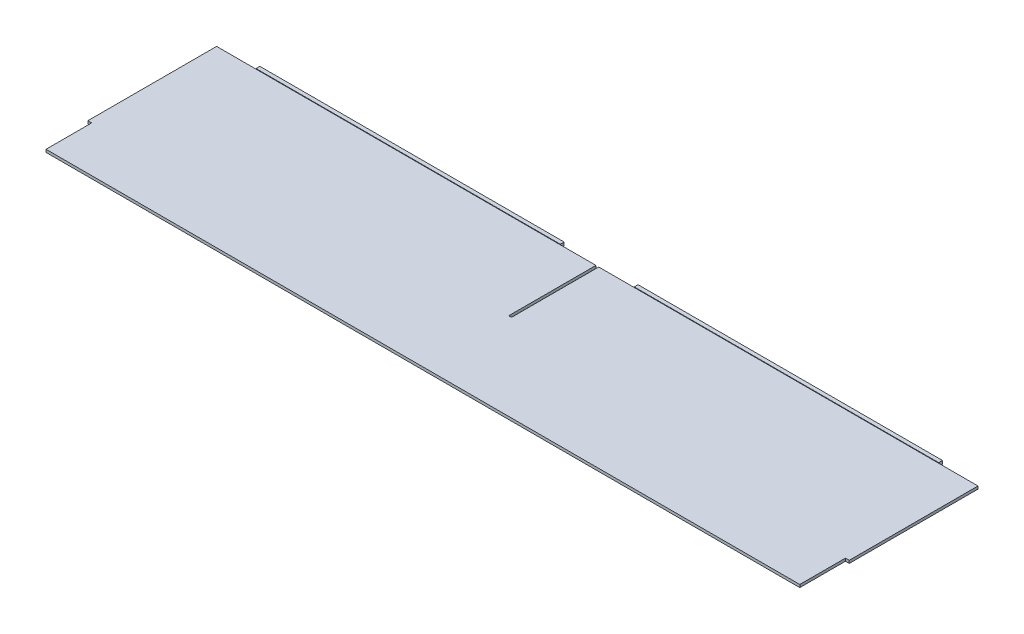
ISO-10303-21;
HEADER;
FILE_DESCRIPTION(('STEP AP214'),'2;1');
FILE_NAME('part.step','',(''),(''),'','','');
FILE_SCHEMA(('AUTOMOTIVE_DESIGN { 1 0 10303 214 1 1 1 1 }'));
ENDSEC;
DATA;
#1=APPLICATION_CONTEXT('core data for automotive mechanical design processes');
#2=APPLICATION_PROTOCOL_DEFINITION('international standard','automotive_design',2000,#1);
#3=PRODUCT_CONTEXT('',#1,'mechanical');
#4=PRODUCT('Part','Part','',(#3));
#5=PRODUCT_RELATED_PRODUCT_CATEGORY('part','',(#4));
#6=PRODUCT_DEFINITION_FORMATION('','',#4);
#7=PRODUCT_DEFINITION_CONTEXT('part definition',#1,'design');
#8=PRODUCT_DEFINITION('design','',#6,#7);
#9=PRODUCT_DEFINITION_SHAPE('','',#8);
#10=(LENGTH_UNIT() NAMED_UNIT(*) SI_UNIT(.MILLI.,.METRE.));
#11=(NAMED_UNIT(*) PLANE_ANGLE_UNIT() SI_UNIT($,.RADIAN.));
#12=(NAMED_UNIT(*) SI_UNIT($,.STERADIAN.) SOLID_ANGLE_UNIT());
#13=UNCERTAINTY_MEASURE_WITH_UNIT(LENGTH_MEASURE(1.E-05),#10,'distance_accuracy_value','');
#14=(GEOMETRIC_REPRESENTATION_CONTEXT(3) GLOBAL_UNCERTAINTY_ASSIGNED_CONTEXT((#13)) GLOBAL_UNIT_ASSIGNED_CONTEXT((#10,
#11,#12)) REPRESENTATION_CONTEXT('',''));
#15=CARTESIAN_POINT('',(0.,0.,0.));
#16=DIRECTION('',(0.,0.,1.));
#17=DIRECTION('',(1.,0.,0.));
#18=AXIS2_PLACEMENT_3D('',#15,#16,#17);
#19=CARTESIAN_POINT('',(-317.6778,1.143,-72.771));
#20=DIRECTION('',(0.,0.,1.));
#21=DIRECTION('',(1.,0.,0.));
#22=AXIS2_PLACEMENT_3D('',#19,#20,#21);
#23=PLANE('',#22);
#24=DIRECTION('',(-1.,0.,0.));
#25=VECTOR('',#24,1.);
#26=CARTESIAN_POINT('',(-317.6778,1.143,-72.771));
#27=LINE('',#26,#25);
#28=CARTESIAN_POINT('',(-1.14299999999913,1.143,-72.771));
#29=VERTEX_POINT('',#28);
#30=CARTESIAN_POINT('',(-30.8229000000015,1.143,-72.771));
#31=VERTEX_POINT('',#30);
#32=EDGE_CURVE('E199',#29,#31,#27,.T.);
#33=ORIENTED_EDGE('',*,*,#32,.F.);
#34=DIRECTION('',(0.,-1.,0.));
#35=VECTOR('',#34,1.);
#36=CARTESIAN_POINT('',(-1.14299999999912,1.143,-72.771));
#37=LINE('',#36,#35);
#38=CARTESIAN_POINT('',(-1.14299999999913,-1.143,-72.771));
#39=VERTEX_POINT('',#38);
#40=EDGE_CURVE('E11',#29,#39,#37,.T.);
#41=ORIENTED_EDGE('',*,*,#40,.T.);
#42=DIRECTION('',(-1.,0.,0.));
#43=VECTOR('',#42,1.);
#44=CARTESIAN_POINT('',(-317.6778,-1.143,-72.771));
#45=LINE('',#44,#43);
#46=CARTESIAN_POINT('',(-30.8229000000015,-1.143,-72.771));
#47=VERTEX_POINT('',#46);
#48=EDGE_CURVE('E197',#39,#47,#45,.T.);
#49=ORIENTED_EDGE('',*,*,#48,.T.);
#50=DIRECTION('',(0.,-1.,0.));
#51=VECTOR('',#50,1.);
#52=CARTESIAN_POINT('',(-30.8229000000015,-1.143,-72.771));
#53=LINE('',#52,#51);
#54=EDGE_CURVE('E231',#31,#47,#53,.T.);
#55=ORIENTED_EDGE('',*,*,#54,.F.);
#56=EDGE_LOOP('',(#33,#41,#49,#55));
#57=FACE_BOUND('',#56,.T.);
#58=ADVANCED_FACE('F33',(#57),#23,.F.);
#59=CARTESIAN_POINT('',(317.6778,1.143,-72.771));
#60=DIRECTION('',(-1.,0.,0.));
#61=DIRECTION('',(0.,0.,1.));
#62=AXIS2_PLACEMENT_3D('',#59,#60,#61);
#63=PLANE('',#62);
#64=DIRECTION('',(0.,-1.,0.));
#65=VECTOR('',#64,1.);
#66=CARTESIAN_POINT('',(317.6778,1.58749999999994,34.671));
#67=LINE('',#66,#65);
#68=CARTESIAN_POINT('',(317.6778,1.143,34.671));
#69=VERTEX_POINT('',#68);
#70=CARTESIAN_POINT('',(317.6778,-1.143,34.671));
#71=VERTEX_POINT('',#70);
#72=EDGE_CURVE('E297',#69,#71,#67,.T.);
#73=ORIENTED_EDGE('',*,*,#72,.T.);
#74=DIRECTION('',(0.,0.,-1.));
#75=VECTOR('',#74,1.);
#76=CARTESIAN_POINT('',(317.6778,-1.143,-72.771));
#77=LINE('',#76,#75);
#78=CARTESIAN_POINT('',(317.6778,-1.143,-72.771));
#79=VERTEX_POINT('',#78);
#80=EDGE_CURVE('E209',#71,#79,#77,.T.);
#81=ORIENTED_EDGE('',*,*,#80,.T.);
#82=DIRECTION('',(0.,-1.,0.));
#83=VECTOR('',#82,1.);
#84=CARTESIAN_POINT('',(317.6778,1.143,-72.771));
#85=LINE('',#84,#83);
#86=CARTESIAN_POINT('',(317.6778,1.143,-72.771));
#87=VERTEX_POINT('',#86);
#88=EDGE_CURVE('E229',#87,#79,#85,.T.);
#89=ORIENTED_EDGE('',*,*,#88,.F.);
#90=DIRECTION('',(0.,0.,-1.));
#91=VECTOR('',#90,1.);
#92=CARTESIAN_POINT('',(317.6778,1.143,-72.771));
#93=LINE('',#92,#91);
#94=EDGE_CURVE('E224',#69,#87,#93,.T.);
#95=ORIENTED_EDGE('',*,*,#94,.F.);
#96=EDGE_LOOP('',(#73,#81,#89,#95));
#97=FACE_BOUND('',#96,.T.);
#98=ADVANCED_FACE('F35',(#97),#63,.F.);
#99=CARTESIAN_POINT('',(-317.6778,1.143,72.771));
#100=DIRECTION('',(0.,0.,-1.));
#101=DIRECTION('',(-1.,0.,0.));
#102=AXIS2_PLACEMENT_3D('',#99,#100,#101);
#103=PLANE('',#102);
#104=DIRECTION('',(0.,-1.,0.));
#105=VECTOR('',#104,1.);
#106=CARTESIAN_POINT('',(314.5028,1.58749999999994,72.771));
#107=LINE('',#106,#105);
#108=CARTESIAN_POINT('',(314.5028,1.143,72.771));
#109=VERTEX_POINT('',#108);
#110=CARTESIAN_POINT('',(314.5028,-1.143,72.771));
#111=VERTEX_POINT('',#110);
#112=EDGE_CURVE('E56',#109,#111,#107,.T.);
#113=ORIENTED_EDGE('',*,*,#112,.F.);
#114=DIRECTION('',(1.,0.,0.));
#115=VECTOR('',#114,1.);
#116=CARTESIAN_POINT('',(-317.6778,1.143,72.771));
#117=LINE('',#116,#115);
#118=CARTESIAN_POINT('',(-314.5028,1.143,72.771));
#119=VERTEX_POINT('',#118);
#120=EDGE_CURVE('E230',#119,#109,#117,.T.);
#121=ORIENTED_EDGE('',*,*,#120,.F.);
#122=DIRECTION('',(0.,-1.,0.));
#123=VECTOR('',#122,1.);
#124=CARTESIAN_POINT('',(-314.5028,1.58749999999994,72.771));
#125=LINE('',#124,#123);
#126=CARTESIAN_POINT('',(-314.5028,-1.143,72.771));
#127=VERTEX_POINT('',#126);
#128=EDGE_CURVE('E321',#119,#127,#125,.T.);
#129=ORIENTED_EDGE('',*,*,#128,.T.);
#130=DIRECTION('',(1.,0.,0.));
#131=VECTOR('',#130,1.);
#132=CARTESIAN_POINT('',(-317.6778,-1.143,72.771));
#133=LINE('',#132,#131);
#134=EDGE_CURVE('E218',#127,#111,#133,.T.);
#135=ORIENTED_EDGE('',*,*,#134,.T.);
#136=EDGE_LOOP('',(#113,#121,#129,#135));
#137=FACE_BOUND('',#136,.T.);
#138=ADVANCED_FACE('F396',(#137),#103,.F.);
#139=CARTESIAN_POINT('',(0.,1.143,0.));
#140=DIRECTION('',(0.,1.,0.));
#141=DIRECTION('',(0.,0.,1.));
#142=AXIS2_PLACEMENT_3D('',#139,#140,#141);
#143=PLANE('',#142);
#144=DIRECTION('',(0.,0.,1.));
#145=VECTOR('',#144,1.);
#146=CARTESIAN_POINT('',(-1.14299999999912,1.143,0.));
#147=LINE('',#146,#145);
#148=CARTESIAN_POINT('',(-1.14299999999912,1.143,0.));
#149=VERTEX_POINT('',#148);
#150=EDGE_CURVE('E402',#29,#149,#147,.T.);
#151=ORIENTED_EDGE('',*,*,#150,.F.);
#152=ORIENTED_EDGE('',*,*,#32,.T.);
#153=CARTESIAN_POINT('',(-284.822900000001,1.143,-72.771));
#154=VERTEX_POINT('',#153);
#155=EDGE_CURVE('E288',#31,#154,#27,.T.);
#156=ORIENTED_EDGE('',*,*,#155,.T.);
#157=CARTESIAN_POINT('',(-317.6778,1.143,-72.771));
#158=VERTEX_POINT('',#157);
#159=EDGE_CURVE('E282',#154,#158,#27,.T.);
#160=ORIENTED_EDGE('',*,*,#159,.T.);
#161=DIRECTION('',(0.,0.,1.));
#162=VECTOR('',#161,1.);
#163=CARTESIAN_POINT('',(-317.6778,1.143,-72.771));
#164=LINE('',#163,#162);
#165=CARTESIAN_POINT('',(-317.6778,1.143,34.671));
#166=VERTEX_POINT('',#165);
#167=EDGE_CURVE('E286',#158,#166,#164,.T.);
#168=ORIENTED_EDGE('',*,*,#167,.T.);
#169=DIRECTION('',(-1.,0.,0.));
#170=VECTOR('',#169,1.);
#171=CARTESIAN_POINT('',(0.,1.143,34.671));
#172=LINE('',#171,#170);
#173=CARTESIAN_POINT('',(-314.5028,1.143,34.671));
#174=VERTEX_POINT('',#173);
#175=EDGE_CURVE('E324',#174,#166,#172,.T.);
#176=ORIENTED_EDGE('',*,*,#175,.F.);
#177=DIRECTION('',(0.,0.,-1.));
#178=VECTOR('',#177,1.);
#179=CARTESIAN_POINT('',(-314.5028,1.143,0.));
#180=LINE('',#179,#178);
#181=EDGE_CURVE('E329',#119,#174,#180,.T.);
#182=ORIENTED_EDGE('',*,*,#181,.F.);
#183=ORIENTED_EDGE('',*,*,#120,.T.);
#184=DIRECTION('',(0.,0.,-1.));
#185=VECTOR('',#184,1.);
#186=CARTESIAN_POINT('',(314.5028,1.143,0.));
#187=LINE('',#186,#185);
#188=CARTESIAN_POINT('',(314.5028,1.143,34.671));
#189=VERTEX_POINT('',#188);
#190=EDGE_CURVE('E308',#109,#189,#187,.T.);
#191=ORIENTED_EDGE('',*,*,#190,.T.);
#192=DIRECTION('',(1.,0.,0.));
#193=VECTOR('',#192,1.);
#194=CARTESIAN_POINT('',(0.,1.143,34.671));
#195=LINE('',#194,#193);
#196=EDGE_CURVE('E307',#189,#69,#195,.T.);
#197=ORIENTED_EDGE('',*,*,#196,.T.);
#198=ORIENTED_EDGE('',*,*,#94,.T.);
#199=CARTESIAN_POINT('',(284.822900000001,1.143,-72.771));
#200=VERTEX_POINT('',#199);
#201=EDGE_CURVE('E283',#87,#200,#27,.T.);
#202=ORIENTED_EDGE('',*,*,#201,.T.);
#203=DIRECTION('',(1.,0.,0.));
#204=VECTOR('',#203,1.);
#205=CARTESIAN_POINT('',(0.,1.143,-72.771));
#206=LINE('',#205,#204);
#207=CARTESIAN_POINT('',(30.8229000000014,1.143,-72.771));
#208=VERTEX_POINT('',#207);
#209=EDGE_CURVE('E241',#208,#200,#206,.T.);
#210=ORIENTED_EDGE('',*,*,#209,.F.);
#211=CARTESIAN_POINT('',(1.19380000000086,1.143,-72.771));
#212=VERTEX_POINT('',#211);
#213=EDGE_CURVE('E287',#208,#212,#27,.T.);
#214=ORIENTED_EDGE('',*,*,#213,.T.);
#215=DIRECTION('',(0.,0.,-1.));
#216=VECTOR('',#215,1.);
#217=CARTESIAN_POINT('',(1.19380000000088,1.143,0.));
#218=LINE('',#217,#216);
#219=CARTESIAN_POINT('',(1.19380000000088,1.143,0.));
#220=VERTEX_POINT('',#219);
#221=EDGE_CURVE('E48',#220,#212,#218,.T.);
#222=ORIENTED_EDGE('',*,*,#221,.F.);
#223=DIRECTION('',(1.,0.,0.));
#224=VECTOR('',#223,1.);
#225=CARTESIAN_POINT('',(0.,1.143,0.));
#226=LINE('',#225,#224);
#227=EDGE_CURVE('E399',#149,#220,#226,.T.);
#228=ORIENTED_EDGE('',*,*,#227,.F.);
#229=EDGE_LOOP('',(#151,#152,#156,#160,#168,#176,#182,#183,#191,#197,#198,#202,#210,#214,#222,#228));
#230=FACE_BOUND('',#229,.T.);
#231=ADVANCED_FACE('F304',(#230),#143,.T.);
#232=CARTESIAN_POINT('',(0.,-1.143,0.));
#233=DIRECTION('',(0.,1.,0.));
#234=DIRECTION('',(0.,0.,1.));
#235=AXIS2_PLACEMENT_3D('',#232,#233,#234);
#236=PLANE('',#235);
#237=ORIENTED_EDGE('',*,*,#48,.F.);
#238=DIRECTION('',(0.,0.,-1.));
#239=VECTOR('',#238,1.);
#240=CARTESIAN_POINT('',(-1.14299999999913,-1.143,-72.771));
#241=LINE('',#240,#239);
#242=CARTESIAN_POINT('',(-1.14299999999912,-1.143,0.));
#243=VERTEX_POINT('',#242);
#244=EDGE_CURVE('E183',#243,#39,#241,.T.);
#245=ORIENTED_EDGE('',*,*,#244,.F.);
#246=DIRECTION('',(-1.,0.,0.));
#247=VECTOR('',#246,1.);
#248=CARTESIAN_POINT('',(-1.14299999999912,-1.143,0.));
#249=LINE('',#248,#247);
#250=CARTESIAN_POINT('',(1.19380000000088,-1.143,0.));
#251=VERTEX_POINT('',#250);
#252=EDGE_CURVE('E526',#251,#243,#249,.T.);
#253=ORIENTED_EDGE('',*,*,#252,.F.);
#254=DIRECTION('',(0.,0.,1.));
#255=VECTOR('',#254,1.);
#256=CARTESIAN_POINT('',(1.19380000000087,-1.143,-72.771));
#257=LINE('',#256,#255);
#258=CARTESIAN_POINT('',(1.19380000000087,-1.143,-72.771));
#259=VERTEX_POINT('',#258);
#260=EDGE_CURVE('E192',#259,#251,#257,.T.);
#261=ORIENTED_EDGE('',*,*,#260,.F.);
#262=CARTESIAN_POINT('',(30.8229000000015,-1.143,-72.771));
#263=VERTEX_POINT('',#262);
#264=EDGE_CURVE('E204',#263,#259,#45,.T.);
#265=ORIENTED_EDGE('',*,*,#264,.F.);
#266=DIRECTION('',(0.,0.,1.));
#267=VECTOR('',#266,1.);
#268=CARTESIAN_POINT('',(30.8229000000015,-1.143,-75.946));
#269=LINE('',#268,#267);
#270=CARTESIAN_POINT('',(30.8229000000015,-1.143,-75.946));
#271=VERTEX_POINT('',#270);
#272=EDGE_CURVE('E254',#271,#263,#269,.T.);
#273=ORIENTED_EDGE('',*,*,#272,.F.);
#274=DIRECTION('',(-1.,0.,0.));
#275=VECTOR('',#274,1.);
#276=CARTESIAN_POINT('',(284.822900000001,-1.143,-75.946));
#277=LINE('',#276,#275);
#278=CARTESIAN_POINT('',(284.822900000001,-1.143,-75.946));
#279=VERTEX_POINT('',#278);
#280=EDGE_CURVE('E334',#279,#271,#277,.T.);
#281=ORIENTED_EDGE('',*,*,#280,.F.);
#282=DIRECTION('',(0.,0.,1.));
#283=VECTOR('',#282,1.);
#284=CARTESIAN_POINT('',(284.822900000001,-1.143,-75.946));
#285=LINE('',#284,#283);
#286=CARTESIAN_POINT('',(284.822900000001,-1.143,-72.771));
#287=VERTEX_POINT('',#286);
#288=EDGE_CURVE('E246',#279,#287,#285,.T.);
#289=ORIENTED_EDGE('',*,*,#288,.T.);
#290=EDGE_CURVE('E207',#79,#287,#45,.T.);
#291=ORIENTED_EDGE('',*,*,#290,.F.);
#292=ORIENTED_EDGE('',*,*,#80,.F.);
#293=DIRECTION('',(-1.,0.,0.));
#294=VECTOR('',#293,1.);
#295=CARTESIAN_POINT('',(317.6778,-1.143,34.671));
#296=LINE('',#295,#294);
#297=CARTESIAN_POINT('',(314.5028,-1.143,34.671));
#298=VERTEX_POINT('',#297);
#299=EDGE_CURVE('E398',#71,#298,#296,.T.);
#300=ORIENTED_EDGE('',*,*,#299,.T.);
#301=DIRECTION('',(0.,0.,1.));
#302=VECTOR('',#301,1.);
#303=CARTESIAN_POINT('',(314.5028,-1.143,72.771));
#304=LINE('',#303,#302);
#305=EDGE_CURVE('E397',#298,#111,#304,.T.);
#306=ORIENTED_EDGE('',*,*,#305,.T.);
#307=ORIENTED_EDGE('',*,*,#134,.F.);
#308=DIRECTION('',(0.,0.,1.));
#309=VECTOR('',#308,1.);
#310=CARTESIAN_POINT('',(-314.5028,-1.143,72.771));
#311=LINE('',#310,#309);
#312=CARTESIAN_POINT('',(-314.5028,-1.143,34.671));
#313=VERTEX_POINT('',#312);
#314=EDGE_CURVE('E314',#313,#127,#311,.T.);
#315=ORIENTED_EDGE('',*,*,#314,.F.);
#316=DIRECTION('',(1.,0.,0.));
#317=VECTOR('',#316,1.);
#318=CARTESIAN_POINT('',(-317.6778,-1.143,34.671));
#319=LINE('',#318,#317);
#320=CARTESIAN_POINT('',(-317.6778,-1.143,34.671));
#321=VERTEX_POINT('',#320);
#322=EDGE_CURVE('E311',#321,#313,#319,.T.);
#323=ORIENTED_EDGE('',*,*,#322,.F.);
#324=DIRECTION('',(0.,0.,1.));
#325=VECTOR('',#324,1.);
#326=CARTESIAN_POINT('',(-317.6778,-1.143,-72.771));
#327=LINE('',#326,#325);
#328=CARTESIAN_POINT('',(-317.6778,-1.143,-72.771));
#329=VERTEX_POINT('',#328);
#330=EDGE_CURVE('E212',#329,#321,#327,.T.);
#331=ORIENTED_EDGE('',*,*,#330,.F.);
#332=CARTESIAN_POINT('',(-284.822900000001,-1.143,-72.771));
#333=VERTEX_POINT('',#332);
#334=EDGE_CURVE('E205',#333,#329,#45,.T.);
#335=ORIENTED_EDGE('',*,*,#334,.F.);
#336=DIRECTION('',(0.,0.,1.));
#337=VECTOR('',#336,1.);
#338=CARTESIAN_POINT('',(-284.822900000001,-1.143,-75.946));
#339=LINE('',#338,#337);
#340=CARTESIAN_POINT('',(-284.822900000001,-1.143,-75.946));
#341=VERTEX_POINT('',#340);
#342=EDGE_CURVE('E274',#341,#333,#339,.T.);
#343=ORIENTED_EDGE('',*,*,#342,.F.);
#344=DIRECTION('',(-1.,0.,0.));
#345=VECTOR('',#344,1.);
#346=CARTESIAN_POINT('',(-30.8229000000015,-1.143,-75.946));
#347=LINE('',#346,#345);
#348=CARTESIAN_POINT('',(-30.8229000000015,-1.143,-75.946));
#349=VERTEX_POINT('',#348);
#350=EDGE_CURVE('E261',#349,#341,#347,.T.);
#351=ORIENTED_EDGE('',*,*,#350,.F.);
#352=DIRECTION('',(0.,0.,1.));
#353=VECTOR('',#352,1.);
#354=CARTESIAN_POINT('',(-30.8229000000015,-1.143,-75.946));
#355=LINE('',#354,#353);
#356=EDGE_CURVE('E203',#349,#47,#355,.T.);
#357=ORIENTED_EDGE('',*,*,#356,.T.);
#358=EDGE_LOOP('',(#237,#245,#253,#261,#265,#273,#281,#289,#291,#292,#300,#306,#307,#315,#323,
#331,#335,#343,#351,#357));
#359=FACE_BOUND('',#358,.T.);
#360=ADVANCED_FACE('F201',(#359),#236,.F.);
#361=DIRECTION('',(0.,-1.,0.));
#362=VECTOR('',#361,1.);
#363=CARTESIAN_POINT('',(284.822900000001,-1.143,-72.771));
#364=LINE('',#363,#362);
#365=EDGE_CURVE('E302',#200,#287,#364,.T.);
#366=ORIENTED_EDGE('',*,*,#365,.F.);
#367=ORIENTED_EDGE('',*,*,#201,.F.);
#368=ORIENTED_EDGE('',*,*,#88,.T.);
#369=ORIENTED_EDGE('',*,*,#290,.T.);
#370=EDGE_LOOP('',(#366,#367,#368,#369));
#371=FACE_BOUND('',#370,.T.);
#372=ADVANCED_FACE('F301',(#371),#23,.F.);
#373=ORIENTED_EDGE('',*,*,#264,.T.);
#374=DIRECTION('',(0.,1.,0.));
#375=VECTOR('',#374,1.);
#376=CARTESIAN_POINT('',(1.19380000000086,1.143,-72.771));
#377=LINE('',#376,#375);
#378=EDGE_CURVE('E41',#259,#212,#377,.T.);
#379=ORIENTED_EDGE('',*,*,#378,.T.);
#380=ORIENTED_EDGE('',*,*,#213,.F.);
#381=DIRECTION('',(0.,1.,0.));
#382=VECTOR('',#381,1.);
#383=CARTESIAN_POINT('',(30.8229000000015,1.58749999999994,-72.771));
#384=LINE('',#383,#382);
#385=EDGE_CURVE('E345',#263,#208,#384,.T.);
#386=ORIENTED_EDGE('',*,*,#385,.F.);
#387=EDGE_LOOP('',(#373,#379,#380,#386));
#388=FACE_BOUND('',#387,.T.);
#389=ADVANCED_FACE('F362',(#388),#23,.F.);
#390=DIRECTION('',(0.,1.,0.));
#391=VECTOR('',#390,1.);
#392=CARTESIAN_POINT('',(-284.822900000001,1.58749999999994,-72.771));
#393=LINE('',#392,#391);
#394=EDGE_CURVE('E244',#333,#154,#393,.T.);
#395=ORIENTED_EDGE('',*,*,#394,.F.);
#396=ORIENTED_EDGE('',*,*,#334,.T.);
#397=DIRECTION('',(0.,-1.,0.));
#398=VECTOR('',#397,1.);
#399=CARTESIAN_POINT('',(-317.6778,1.143,-72.771));
#400=LINE('',#399,#398);
#401=EDGE_CURVE('E227',#158,#329,#400,.T.);
#402=ORIENTED_EDGE('',*,*,#401,.F.);
#403=ORIENTED_EDGE('',*,*,#159,.F.);
#404=EDGE_LOOP('',(#395,#396,#402,#403));
#405=FACE_BOUND('',#404,.T.);
#406=ADVANCED_FACE('F369',(#405),#23,.F.);
#407=CARTESIAN_POINT('',(-317.6778,1.143,-72.771));
#408=DIRECTION('',(1.,0.,0.));
#409=DIRECTION('',(0.,0.,-1.));
#410=AXIS2_PLACEMENT_3D('',#407,#408,#409);
#411=PLANE('',#410);
#412=ORIENTED_EDGE('',*,*,#330,.T.);
#413=DIRECTION('',(0.,-1.,0.));
#414=VECTOR('',#413,1.);
#415=CARTESIAN_POINT('',(-317.6778,1.58749999999994,34.671));
#416=LINE('',#415,#414);
#417=EDGE_CURVE('E320',#166,#321,#416,.T.);
#418=ORIENTED_EDGE('',*,*,#417,.F.);
#419=ORIENTED_EDGE('',*,*,#167,.F.);
#420=ORIENTED_EDGE('',*,*,#401,.T.);
#421=EDGE_LOOP('',(#412,#418,#419,#420));
#422=FACE_BOUND('',#421,.T.);
#423=ADVANCED_FACE('F384',(#422),#411,.F.);
#424=CARTESIAN_POINT('',(0.,0.,-72.771));
#425=DIRECTION('',(0.,0.,1.));
#426=DIRECTION('',(1.,0.,0.));
#427=AXIS2_PLACEMENT_3D('',#424,#425,#426);
#428=PLANE('',#427);
#429=ORIENTED_EDGE('',*,*,#155,.F.);
#430=CARTESIAN_POINT('',(-30.8229000000015,1.58749999999994,-72.771));
#431=VERTEX_POINT('',#430);
#432=EDGE_CURVE('E235',#431,#31,#53,.T.);
#433=ORIENTED_EDGE('',*,*,#432,.F.);
#434=DIRECTION('',(1.,0.,0.));
#435=VECTOR('',#434,1.);
#436=CARTESIAN_POINT('',(-30.8229000000015,1.58749999999994,-72.771));
#437=LINE('',#436,#435);
#438=CARTESIAN_POINT('',(-284.822900000001,1.58749999999994,-72.771));
#439=VERTEX_POINT('',#438);
#440=EDGE_CURVE('E262',#439,#431,#437,.T.);
#441=ORIENTED_EDGE('',*,*,#440,.F.);
#442=EDGE_CURVE('E240',#154,#439,#393,.T.);
#443=ORIENTED_EDGE('',*,*,#442,.F.);
#444=EDGE_LOOP('',(#429,#433,#441,#443));
#445=FACE_BOUND('',#444,.T.);
#446=ADVANCED_FACE('F374',(#445),#428,.T.);
#447=CARTESIAN_POINT('',(-30.8229000000015,-1.143,-75.946));
#448=DIRECTION('',(-1.,0.,0.));
#449=DIRECTION('',(0.,0.,1.));
#450=AXIS2_PLACEMENT_3D('',#447,#448,#449);
#451=PLANE('',#450);
#452=ORIENTED_EDGE('',*,*,#432,.T.);
#453=ORIENTED_EDGE('',*,*,#54,.T.);
#454=ORIENTED_EDGE('',*,*,#356,.F.);
#455=DIRECTION('',(0.,-1.,0.));
#456=VECTOR('',#455,1.);
#457=CARTESIAN_POINT('',(-30.8229000000015,-1.143,-75.946));
#458=LINE('',#457,#456);
#459=CARTESIAN_POINT('',(-30.8229000000015,1.58749999999994,-75.946));
#460=VERTEX_POINT('',#459);
#461=EDGE_CURVE('E258',#460,#349,#458,.T.);
#462=ORIENTED_EDGE('',*,*,#461,.F.);
#463=DIRECTION('',(0.,0.,1.));
#464=VECTOR('',#463,1.);
#465=CARTESIAN_POINT('',(-30.8229000000015,1.58749999999994,-75.946));
#466=LINE('',#465,#464);
#467=EDGE_CURVE('E266',#460,#431,#466,.T.);
#468=ORIENTED_EDGE('',*,*,#467,.T.);
#469=EDGE_LOOP('',(#452,#453,#454,#462,#468));
#470=FACE_BOUND('',#469,.T.);
#471=ADVANCED_FACE('F442',(#470),#451,.F.);
#472=CARTESIAN_POINT('',(-284.822900000001,1.58749999999994,-75.946));
#473=DIRECTION('',(1.,0.,0.));
#474=DIRECTION('',(0.,1.,0.));
#475=AXIS2_PLACEMENT_3D('',#472,#473,#474);
#476=PLANE('',#475);
#477=ORIENTED_EDGE('',*,*,#394,.T.);
#478=ORIENTED_EDGE('',*,*,#442,.T.);
#479=DIRECTION('',(0.,0.,1.));
#480=VECTOR('',#479,1.);
#481=CARTESIAN_POINT('',(-284.822900000001,1.58749999999994,-75.946));
#482=LINE('',#481,#480);
#483=CARTESIAN_POINT('',(-284.822900000001,1.58749999999994,-75.946));
#484=VERTEX_POINT('',#483);
#485=EDGE_CURVE('E270',#484,#439,#482,.T.);
#486=ORIENTED_EDGE('',*,*,#485,.F.);
#487=DIRECTION('',(0.,1.,0.));
#488=VECTOR('',#487,1.);
#489=CARTESIAN_POINT('',(-284.822900000001,1.58749999999994,-75.946));
#490=LINE('',#489,#488);
#491=EDGE_CURVE('E264',#341,#484,#490,.T.);
#492=ORIENTED_EDGE('',*,*,#491,.F.);
#493=ORIENTED_EDGE('',*,*,#342,.T.);
#494=EDGE_LOOP('',(#477,#478,#486,#492,#493));
#495=FACE_BOUND('',#494,.T.);
#496=ADVANCED_FACE('F377',(#495),#476,.F.);
#497=CARTESIAN_POINT('',(-30.8229000000015,1.58749999999994,-75.946));
#498=DIRECTION('',(0.,-1.,0.));
#499=DIRECTION('',(0.,0.,-1.));
#500=AXIS2_PLACEMENT_3D('',#497,#498,#499);
#501=PLANE('',#500);
#502=ORIENTED_EDGE('',*,*,#440,.T.);
#503=ORIENTED_EDGE('',*,*,#467,.F.);
#504=DIRECTION('',(1.,0.,0.));
#505=VECTOR('',#504,1.);
#506=CARTESIAN_POINT('',(-30.8229000000015,1.58749999999994,-75.946));
#507=LINE('',#506,#505);
#508=EDGE_CURVE('E265',#484,#460,#507,.T.);
#509=ORIENTED_EDGE('',*,*,#508,.F.);
#510=ORIENTED_EDGE('',*,*,#485,.T.);
#511=EDGE_LOOP('',(#502,#503,#509,#510));
#512=FACE_BOUND('',#511,.T.);
#513=ADVANCED_FACE('F381',(#512),#501,.F.);
#514=CARTESIAN_POINT('',(0.,0.,-75.946));
#515=DIRECTION('',(0.,0.,1.));
#516=DIRECTION('',(1.,0.,0.));
#517=AXIS2_PLACEMENT_3D('',#514,#515,#516);
#518=PLANE('',#517);
#519=ORIENTED_EDGE('',*,*,#461,.T.);
#520=ORIENTED_EDGE('',*,*,#350,.T.);
#521=ORIENTED_EDGE('',*,*,#491,.T.);
#522=ORIENTED_EDGE('',*,*,#508,.T.);
#523=EDGE_LOOP('',(#519,#520,#521,#522));
#524=FACE_BOUND('',#523,.T.);
#525=ADVANCED_FACE('F382',(#524),#518,.F.);
#526=CARTESIAN_POINT('',(284.822900000001,-1.143,-75.946));
#527=DIRECTION('',(-1.,0.,0.));
#528=DIRECTION('',(0.,-1.,0.));
#529=AXIS2_PLACEMENT_3D('',#526,#527,#528);
#530=PLANE('',#529);
#531=CARTESIAN_POINT('',(284.822900000001,1.58749999999994,-72.771));
#532=VERTEX_POINT('',#531);
#533=EDGE_CURVE('E342',#532,#200,#364,.T.);
#534=ORIENTED_EDGE('',*,*,#533,.T.);
#535=ORIENTED_EDGE('',*,*,#365,.T.);
#536=ORIENTED_EDGE('',*,*,#288,.F.);
#537=DIRECTION('',(0.,-1.,0.));
#538=VECTOR('',#537,1.);
#539=CARTESIAN_POINT('',(284.822900000001,-1.143,-75.946));
#540=LINE('',#539,#538);
#541=CARTESIAN_POINT('',(284.822900000001,1.58749999999994,-75.946));
#542=VERTEX_POINT('',#541);
#543=EDGE_CURVE('E331',#542,#279,#540,.T.);
#544=ORIENTED_EDGE('',*,*,#543,.F.);
#545=DIRECTION('',(0.,0.,1.));
#546=VECTOR('',#545,1.);
#547=CARTESIAN_POINT('',(284.822900000001,1.58749999999994,-75.946));
#548=LINE('',#547,#546);
#549=EDGE_CURVE('E341',#542,#532,#548,.T.);
#550=ORIENTED_EDGE('',*,*,#549,.T.);
#551=EDGE_LOOP('',(#534,#535,#536,#544,#550));
#552=FACE_BOUND('',#551,.T.);
#553=ADVANCED_FACE('F456',(#552),#530,.F.);
#554=CARTESIAN_POINT('',(30.8229000000015,1.58749999999994,-75.946));
#555=DIRECTION('',(1.,0.,0.));
#556=DIRECTION('',(0.,0.,-1.));
#557=AXIS2_PLACEMENT_3D('',#554,#555,#556);
#558=PLANE('',#557);
#559=ORIENTED_EDGE('',*,*,#385,.T.);
#560=CARTESIAN_POINT('',(30.8229000000015,1.58749999999994,-72.771));
#561=VERTEX_POINT('',#560);
#562=EDGE_CURVE('E344',#208,#561,#384,.T.);
#563=ORIENTED_EDGE('',*,*,#562,.T.);
#564=DIRECTION('',(0.,0.,1.));
#565=VECTOR('',#564,1.);
#566=CARTESIAN_POINT('',(30.8229000000015,1.58749999999994,-75.946));
#567=LINE('',#566,#565);
#568=CARTESIAN_POINT('',(30.8229000000015,1.58749999999994,-75.946));
#569=VERTEX_POINT('',#568);
#570=EDGE_CURVE('E351',#569,#561,#567,.T.);
#571=ORIENTED_EDGE('',*,*,#570,.F.);
#572=DIRECTION('',(0.,1.,0.));
#573=VECTOR('',#572,1.);
#574=CARTESIAN_POINT('',(30.8229000000015,1.58749999999994,-75.946));
#575=LINE('',#574,#573);
#576=EDGE_CURVE('E337',#271,#569,#575,.T.);
#577=ORIENTED_EDGE('',*,*,#576,.F.);
#578=ORIENTED_EDGE('',*,*,#272,.T.);
#579=EDGE_LOOP('',(#559,#563,#571,#577,#578));
#580=FACE_BOUND('',#579,.T.);
#581=ADVANCED_FACE('F357',(#580),#558,.F.);
#582=CARTESIAN_POINT('',(284.822900000001,1.58749999999994,-75.946));
#583=DIRECTION('',(0.,-1.,0.));
#584=DIRECTION('',(0.,0.,-1.));
#585=AXIS2_PLACEMENT_3D('',#582,#583,#584);
#586=PLANE('',#585);
#587=DIRECTION('',(1.,0.,0.));
#588=VECTOR('',#587,1.);
#589=CARTESIAN_POINT('',(284.822900000001,1.58749999999994,-72.771));
#590=LINE('',#589,#588);
#591=EDGE_CURVE('E335',#561,#532,#590,.T.);
#592=ORIENTED_EDGE('',*,*,#591,.T.);
#593=ORIENTED_EDGE('',*,*,#549,.F.);
#594=DIRECTION('',(1.,0.,0.));
#595=VECTOR('',#594,1.);
#596=CARTESIAN_POINT('',(284.822900000001,1.58749999999994,-75.946));
#597=LINE('',#596,#595);
#598=EDGE_CURVE('E339',#569,#542,#597,.T.);
#599=ORIENTED_EDGE('',*,*,#598,.F.);
#600=ORIENTED_EDGE('',*,*,#570,.T.);
#601=EDGE_LOOP('',(#592,#593,#599,#600));
#602=FACE_BOUND('',#601,.T.);
#603=ADVANCED_FACE('F462',(#602),#586,.F.);
#604=CARTESIAN_POINT('',(0.,0.,-75.946));
#605=DIRECTION('',(0.,0.,1.));
#606=DIRECTION('',(1.,0.,0.));
#607=AXIS2_PLACEMENT_3D('',#604,#605,#606);
#608=PLANE('',#607);
#609=ORIENTED_EDGE('',*,*,#543,.T.);
#610=ORIENTED_EDGE('',*,*,#280,.T.);
#611=ORIENTED_EDGE('',*,*,#576,.T.);
#612=ORIENTED_EDGE('',*,*,#598,.T.);
#613=EDGE_LOOP('',(#609,#610,#611,#612));
#614=FACE_BOUND('',#613,.T.);
#615=ADVANCED_FACE('F465',(#614),#608,.F.);
#616=CARTESIAN_POINT('',(0.,0.,-72.771));
#617=DIRECTION('',(0.,0.,1.));
#618=DIRECTION('',(1.,0.,0.));
#619=AXIS2_PLACEMENT_3D('',#616,#617,#618);
#620=PLANE('',#619);
#621=ORIENTED_EDGE('',*,*,#562,.F.);
#622=ORIENTED_EDGE('',*,*,#209,.T.);
#623=ORIENTED_EDGE('',*,*,#533,.F.);
#624=ORIENTED_EDGE('',*,*,#591,.F.);
#625=EDGE_LOOP('',(#621,#622,#623,#624));
#626=FACE_BOUND('',#625,.T.);
#627=ADVANCED_FACE('F467',(#626),#620,.T.);
#628=CARTESIAN_POINT('',(-314.5028,1.58749999999994,72.771));
#629=DIRECTION('',(1.,0.,0.));
#630=DIRECTION('',(0.,0.,-1.));
#631=AXIS2_PLACEMENT_3D('',#628,#629,#630);
#632=PLANE('',#631);
#633=ORIENTED_EDGE('',*,*,#181,.T.);
#634=DIRECTION('',(0.,-1.,0.));
#635=VECTOR('',#634,1.);
#636=CARTESIAN_POINT('',(-314.5028,1.58749999999994,34.671));
#637=LINE('',#636,#635);
#638=EDGE_CURVE('E325',#174,#313,#637,.T.);
#639=ORIENTED_EDGE('',*,*,#638,.T.);
#640=ORIENTED_EDGE('',*,*,#314,.T.);
#641=ORIENTED_EDGE('',*,*,#128,.F.);
#642=EDGE_LOOP('',(#633,#639,#640,#641));
#643=FACE_BOUND('',#642,.T.);
#644=ADVANCED_FACE('F393',(#643),#632,.F.);
#645=CARTESIAN_POINT('',(-317.6778,1.58749999999994,34.671));
#646=DIRECTION('',(0.,0.,-1.));
#647=DIRECTION('',(-1.,0.,0.));
#648=AXIS2_PLACEMENT_3D('',#645,#646,#647);
#649=PLANE('',#648);
#650=ORIENTED_EDGE('',*,*,#175,.T.);
#651=ORIENTED_EDGE('',*,*,#417,.T.);
#652=ORIENTED_EDGE('',*,*,#322,.T.);
#653=ORIENTED_EDGE('',*,*,#638,.F.);
#654=EDGE_LOOP('',(#650,#651,#652,#653));
#655=FACE_BOUND('',#654,.T.);
#656=ADVANCED_FACE('F390',(#655),#649,.F.);
#657=CARTESIAN_POINT('',(317.6778,1.58749999999994,34.671));
#658=DIRECTION('',(0.,0.,1.));
#659=DIRECTION('',(1.,0.,0.));
#660=AXIS2_PLACEMENT_3D('',#657,#658,#659);
#661=PLANE('',#660);
#662=DIRECTION('',(0.,-1.,0.));
#663=VECTOR('',#662,1.);
#664=CARTESIAN_POINT('',(314.5028,1.58749999999994,34.671));
#665=LINE('',#664,#663);
#666=EDGE_CURVE('E407',#189,#298,#665,.T.);
#667=ORIENTED_EDGE('',*,*,#666,.T.);
#668=ORIENTED_EDGE('',*,*,#299,.F.);
#669=ORIENTED_EDGE('',*,*,#72,.F.);
#670=ORIENTED_EDGE('',*,*,#196,.F.);
#671=EDGE_LOOP('',(#667,#668,#669,#670));
#672=FACE_BOUND('',#671,.T.);
#673=ADVANCED_FACE('F408',(#672),#661,.T.);
#674=CARTESIAN_POINT('',(314.5028,1.58749999999994,72.771));
#675=DIRECTION('',(1.,0.,0.));
#676=DIRECTION('',(0.,0.,-1.));
#677=AXIS2_PLACEMENT_3D('',#674,#675,#676);
#678=PLANE('',#677);
#679=ORIENTED_EDGE('',*,*,#112,.T.);
#680=ORIENTED_EDGE('',*,*,#305,.F.);
#681=ORIENTED_EDGE('',*,*,#666,.F.);
#682=ORIENTED_EDGE('',*,*,#190,.F.);
#683=EDGE_LOOP('',(#679,#680,#681,#682));
#684=FACE_BOUND('',#683,.T.);
#685=ADVANCED_FACE('F409',(#684),#678,.T.);
#686=CARTESIAN_POINT('',(-1.14299999999913,1.58749999999994,-72.771));
#687=DIRECTION('',(-1.,0.,0.));
#688=DIRECTION('',(0.,0.,1.));
#689=AXIS2_PLACEMENT_3D('',#686,#687,#688);
#690=PLANE('',#689);
#691=ORIENTED_EDGE('',*,*,#150,.T.);
#692=DIRECTION('',(0.,-1.,0.));
#693=VECTOR('',#692,1.);
#694=CARTESIAN_POINT('',(-1.14299999999912,1.58749999999994,0.));
#695=LINE('',#694,#693);
#696=EDGE_CURVE('E187',#149,#243,#695,.T.);
#697=ORIENTED_EDGE('',*,*,#696,.T.);
#698=ORIENTED_EDGE('',*,*,#244,.T.);
#699=ORIENTED_EDGE('',*,*,#40,.F.);
#700=EDGE_LOOP('',(#691,#697,#698,#699));
#701=FACE_BOUND('',#700,.T.);
#702=ADVANCED_FACE('F184',(#701),#690,.F.);
#703=CARTESIAN_POINT('',(-1.14299999999912,1.58749999999994,0.));
#704=DIRECTION('',(0.,0.,1.));
#705=DIRECTION('',(1.,0.,0.));
#706=AXIS2_PLACEMENT_3D('',#703,#704,#705);
#707=PLANE('',#706);
#708=ORIENTED_EDGE('',*,*,#227,.T.);
#709=DIRECTION('',(0.,-1.,0.));
#710=VECTOR('',#709,1.);
#711=CARTESIAN_POINT('',(1.19380000000088,1.58749999999994,0.));
#712=LINE('',#711,#710);
#713=EDGE_CURVE('E525',#220,#251,#712,.T.);
#714=ORIENTED_EDGE('',*,*,#713,.T.);
#715=ORIENTED_EDGE('',*,*,#252,.T.);
#716=ORIENTED_EDGE('',*,*,#696,.F.);
#717=EDGE_LOOP('',(#708,#714,#715,#716));
#718=FACE_BOUND('',#717,.T.);
#719=ADVANCED_FACE('F416',(#718),#707,.F.);
#720=CARTESIAN_POINT('',(1.19380000000087,1.58749999999994,-72.771));
#721=DIRECTION('',(1.,0.,0.));
#722=DIRECTION('',(0.,0.,-1.));
#723=AXIS2_PLACEMENT_3D('',#720,#721,#722);
#724=PLANE('',#723);
#725=ORIENTED_EDGE('',*,*,#221,.T.);
#726=ORIENTED_EDGE('',*,*,#378,.F.);
#727=ORIENTED_EDGE('',*,*,#260,.T.);
#728=ORIENTED_EDGE('',*,*,#713,.F.);
#729=EDGE_LOOP('',(#725,#726,#727,#728));
#730=FACE_BOUND('',#729,.T.);
#731=ADVANCED_FACE('F511',(#730),#724,.F.);
#732=CLOSED_SHELL('',(#58,#98,#138,#231,#360,#372,#389,#406,#423,#446,#471,#496,#513,#525,#553,
#581,#603,#615,#627,#644,#656,#673,#685,#702,#719,#731));
#733=MANIFOLD_SOLID_BREP('B2',#732);
#734=ADVANCED_BREP_SHAPE_REPRESENTATION('',(#18,#733),#14);
#735=SHAPE_DEFINITION_REPRESENTATION(#9,#734);
ENDSEC;
END-ISO-10303-21;
